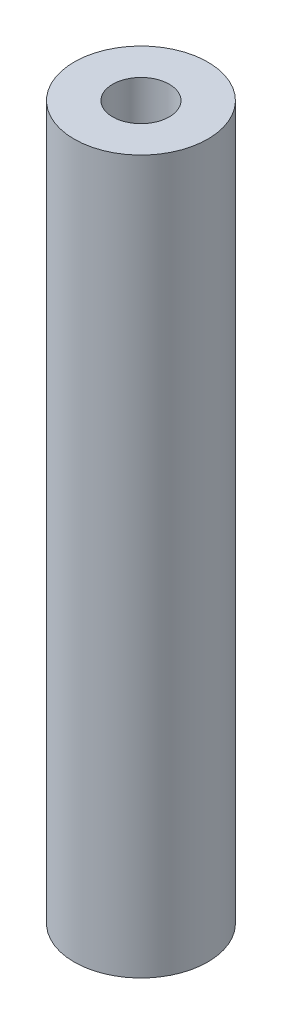
ISO-10303-21;
HEADER;
FILE_DESCRIPTION(('STEP AP214'),'2;1');
FILE_NAME('part.step','',(''),(''),'','','');
FILE_SCHEMA(('AUTOMOTIVE_DESIGN { 1 0 10303 214 1 1 1 1 }'));
ENDSEC;
DATA;
#1=APPLICATION_CONTEXT('core data for automotive mechanical design processes');
#2=APPLICATION_PROTOCOL_DEFINITION('international standard','automotive_design',2000,#1);
#3=PRODUCT_CONTEXT('',#1,'mechanical');
#4=PRODUCT('Part','Part','',(#3));
#5=PRODUCT_RELATED_PRODUCT_CATEGORY('part','',(#4));
#6=PRODUCT_DEFINITION_FORMATION('','',#4);
#7=PRODUCT_DEFINITION_CONTEXT('part definition',#1,'design');
#8=PRODUCT_DEFINITION('design','',#6,#7);
#9=PRODUCT_DEFINITION_SHAPE('','',#8);
#10=(LENGTH_UNIT() NAMED_UNIT(*) SI_UNIT(.MILLI.,.METRE.));
#11=(NAMED_UNIT(*) PLANE_ANGLE_UNIT() SI_UNIT($,.RADIAN.));
#12=(NAMED_UNIT(*) SI_UNIT($,.STERADIAN.) SOLID_ANGLE_UNIT());
#13=UNCERTAINTY_MEASURE_WITH_UNIT(LENGTH_MEASURE(1.E-05),#10,'distance_accuracy_value','');
#14=(GEOMETRIC_REPRESENTATION_CONTEXT(3) GLOBAL_UNCERTAINTY_ASSIGNED_CONTEXT((#13)) GLOBAL_UNIT_ASSIGNED_CONTEXT((#10,
#11,#12)) REPRESENTATION_CONTEXT('',''));
#15=CARTESIAN_POINT('',(0.,0.,0.));
#16=DIRECTION('',(0.,0.,1.));
#17=DIRECTION('',(1.,0.,0.));
#18=AXIS2_PLACEMENT_3D('',#15,#16,#17);
#19=CARTESIAN_POINT('',(0.,50.8,0.));
#20=DIRECTION('',(0.,1.,0.));
#21=DIRECTION('',(0.,0.,1.));
#22=AXIS2_PLACEMENT_3D('',#19,#20,#21);
#23=PLANE('',#22);
#24=CARTESIAN_POINT('',(0.,50.8,0.));
#25=DIRECTION('',(0.,1.,0.));
#26=DIRECTION('',(0.,0.,1.));
#27=AXIS2_PLACEMENT_3D('',#24,#25,#26);
#28=CIRCLE('',#27,4.7625);
#29=CARTESIAN_POINT('',(0.,50.8,4.7625));
#30=VERTEX_POINT('',#29);
#31=EDGE_CURVE('E10',#30,#30,#28,.T.);
#32=ORIENTED_EDGE('',*,*,#31,.T.);
#33=EDGE_LOOP('',(#32));
#34=FACE_BOUND('',#33,.T.);
#35=CARTESIAN_POINT('',(0.,50.8,0.));
#36=DIRECTION('',(0.,1.,0.));
#37=DIRECTION('',(0.,0.,1.));
#38=AXIS2_PLACEMENT_3D('',#35,#36,#37);
#39=CIRCLE('',#38,2.0193);
#40=CARTESIAN_POINT('',(0.,50.8,2.0193));
#41=VERTEX_POINT('',#40);
#42=EDGE_CURVE('E42',#41,#41,#39,.T.);
#43=ORIENTED_EDGE('',*,*,#42,.F.);
#44=EDGE_LOOP('',(#43));
#45=FACE_BOUND('',#44,.T.);
#46=ADVANCED_FACE('F31',(#34,#45),#23,.T.);
#47=CARTESIAN_POINT('',(0.,0.,0.));
#48=DIRECTION('',(0.,1.,0.));
#49=DIRECTION('',(0.,0.,1.));
#50=AXIS2_PLACEMENT_3D('',#47,#48,#49);
#51=PLANE('',#50);
#52=CARTESIAN_POINT('',(0.,0.,0.));
#53=DIRECTION('',(0.,1.,0.));
#54=DIRECTION('',(0.,0.,1.));
#55=AXIS2_PLACEMENT_3D('',#52,#53,#54);
#56=CIRCLE('',#55,4.7625);
#57=CARTESIAN_POINT('',(0.,0.,4.7625));
#58=VERTEX_POINT('',#57);
#59=EDGE_CURVE('E35',#58,#58,#56,.T.);
#60=ORIENTED_EDGE('',*,*,#59,.F.);
#61=EDGE_LOOP('',(#60));
#62=FACE_BOUND('',#61,.T.);
#63=CARTESIAN_POINT('',(0.,0.,0.));
#64=DIRECTION('',(0.,1.,0.));
#65=DIRECTION('',(0.,0.,1.));
#66=AXIS2_PLACEMENT_3D('',#63,#64,#65);
#67=CIRCLE('',#66,2.0193);
#68=CARTESIAN_POINT('',(0.,0.,2.0193));
#69=VERTEX_POINT('',#68);
#70=EDGE_CURVE('E44',#69,#69,#67,.T.);
#71=ORIENTED_EDGE('',*,*,#70,.T.);
#72=EDGE_LOOP('',(#71));
#73=FACE_BOUND('',#72,.T.);
#74=ADVANCED_FACE('F54',(#62,#73),#51,.F.);
#75=CARTESIAN_POINT('',(0.,50.8,0.));
#76=DIRECTION('',(0.,-1.,0.));
#77=DIRECTION('',(0.,0.,-1.));
#78=AXIS2_PLACEMENT_3D('',#75,#76,#77);
#79=CYLINDRICAL_SURFACE('',#78,4.7625);
#80=ORIENTED_EDGE('',*,*,#31,.F.);
#81=EDGE_LOOP('',(#80));
#82=FACE_BOUND('',#81,.T.);
#83=ORIENTED_EDGE('',*,*,#59,.T.);
#84=EDGE_LOOP('',(#83));
#85=FACE_BOUND('',#84,.T.);
#86=ADVANCED_FACE('F33',(#82,#85),#79,.T.);
#87=CARTESIAN_POINT('',(0.,50.8,0.));
#88=DIRECTION('',(0.,-1.,0.));
#89=DIRECTION('',(0.,0.,-1.));
#90=AXIS2_PLACEMENT_3D('',#87,#88,#89);
#91=CYLINDRICAL_SURFACE('',#90,2.0193);
#92=ORIENTED_EDGE('',*,*,#42,.T.);
#93=EDGE_LOOP('',(#92));
#94=FACE_BOUND('',#93,.T.);
#95=ORIENTED_EDGE('',*,*,#70,.F.);
#96=EDGE_LOOP('',(#95));
#97=FACE_BOUND('',#96,.T.);
#98=ADVANCED_FACE('F50',(#94,#97),#91,.F.);
#99=CLOSED_SHELL('',(#46,#74,#86,#98));
#100=MANIFOLD_SOLID_BREP('B2',#99);
#101=ADVANCED_BREP_SHAPE_REPRESENTATION('',(#18,#100),#14);
#102=SHAPE_DEFINITION_REPRESENTATION(#9,#101);
ENDSEC;
END-ISO-10303-21;
